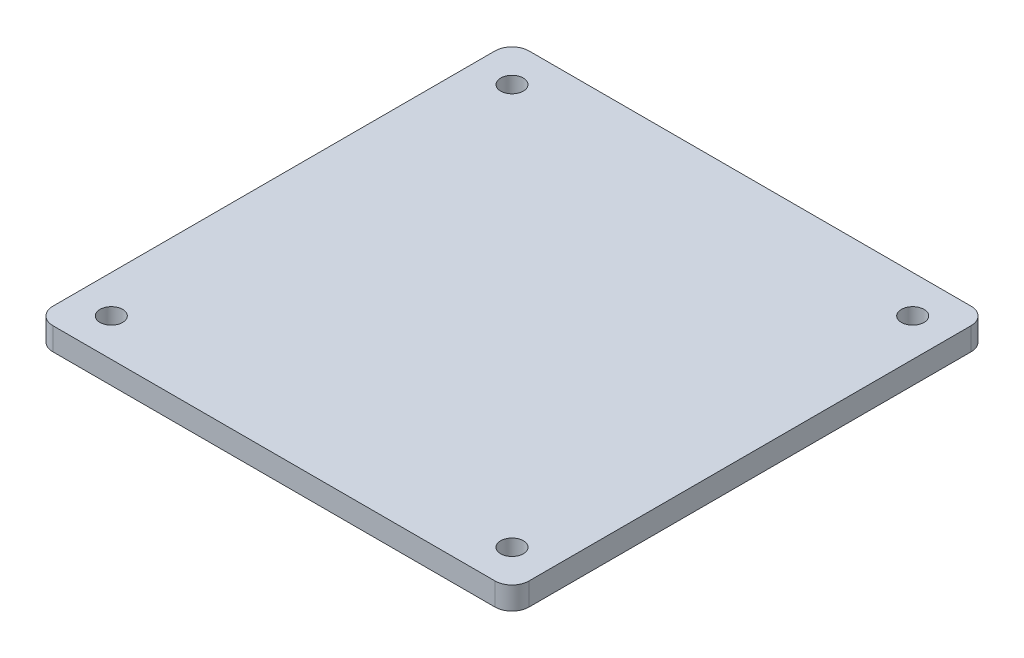
ISO-10303-21;
HEADER;
FILE_DESCRIPTION(('STEP AP214'),'2;1');
FILE_NAME('part.step','',(''),(''),'','','');
FILE_SCHEMA(('AUTOMOTIVE_DESIGN { 1 0 10303 214 1 1 1 1 }'));
ENDSEC;
DATA;
#1=APPLICATION_CONTEXT('core data for automotive mechanical design processes');
#2=APPLICATION_PROTOCOL_DEFINITION('international standard','automotive_design',2000,#1);
#3=PRODUCT_CONTEXT('',#1,'mechanical');
#4=PRODUCT('Part','Part','',(#3));
#5=PRODUCT_RELATED_PRODUCT_CATEGORY('part','',(#4));
#6=PRODUCT_DEFINITION_FORMATION('','',#4);
#7=PRODUCT_DEFINITION_CONTEXT('part definition',#1,'design');
#8=PRODUCT_DEFINITION('design','',#6,#7);
#9=PRODUCT_DEFINITION_SHAPE('','',#8);
#10=(LENGTH_UNIT() NAMED_UNIT(*) SI_UNIT(.MILLI.,.METRE.));
#11=(NAMED_UNIT(*) PLANE_ANGLE_UNIT() SI_UNIT($,.RADIAN.));
#12=(NAMED_UNIT(*) SI_UNIT($,.STERADIAN.) SOLID_ANGLE_UNIT());
#13=UNCERTAINTY_MEASURE_WITH_UNIT(LENGTH_MEASURE(1.E-05),#10,'distance_accuracy_value','');
#14=(GEOMETRIC_REPRESENTATION_CONTEXT(3) GLOBAL_UNCERTAINTY_ASSIGNED_CONTEXT((#13)) GLOBAL_UNIT_ASSIGNED_CONTEXT((#10,
#11,#12)) REPRESENTATION_CONTEXT('',''));
#15=CARTESIAN_POINT('',(0.,0.,0.));
#16=DIRECTION('',(0.,0.,1.));
#17=DIRECTION('',(1.,0.,0.));
#18=AXIS2_PLACEMENT_3D('',#15,#16,#17);
#19=CARTESIAN_POINT('',(195.,20.,195.));
#20=DIRECTION('',(0.,1.,0.));
#21=DIRECTION('',(0.,0.,1.));
#22=AXIS2_PLACEMENT_3D('',#19,#20,#21);
#23=PLANE('',#22);
#24=CARTESIAN_POINT('',(-176.776695296637,20.,176.776695296637));
#25=DIRECTION('',(0.,1.,0.));
#26=DIRECTION('',(0.,0.,1.));
#27=AXIS2_PLACEMENT_3D('',#24,#25,#26);
#28=CIRCLE('',#27,10.);
#29=CARTESIAN_POINT('',(-176.776695296637,20.,186.776695296637));
#30=VERTEX_POINT('',#29);
#31=EDGE_CURVE('E208',#30,#30,#28,.T.);
#32=ORIENTED_EDGE('',*,*,#31,.F.);
#33=EDGE_LOOP('',(#32));
#34=FACE_BOUND('',#33,.T.);
#35=CARTESIAN_POINT('',(176.776695296637,20.,-176.776695296637));
#36=DIRECTION('',(0.,1.,0.));
#37=DIRECTION('',(0.,0.,1.));
#38=AXIS2_PLACEMENT_3D('',#35,#36,#37);
#39=CIRCLE('',#38,10.);
#40=CARTESIAN_POINT('',(176.776695296637,20.,-166.776695296637));
#41=VERTEX_POINT('',#40);
#42=EDGE_CURVE('E147',#41,#41,#39,.T.);
#43=ORIENTED_EDGE('',*,*,#42,.F.);
#44=EDGE_LOOP('',(#43));
#45=FACE_BOUND('',#44,.T.);
#46=CARTESIAN_POINT('',(195.,20.,195.));
#47=DIRECTION('',(0.,1.,0.));
#48=DIRECTION('',(0.,0.,1.));
#49=AXIS2_PLACEMENT_3D('',#46,#47,#48);
#50=CIRCLE('',#49,15.);
#51=CARTESIAN_POINT('',(195.,20.,210.));
#52=VERTEX_POINT('',#51);
#53=CARTESIAN_POINT('',(210.,20.,195.));
#54=VERTEX_POINT('',#53);
#55=EDGE_CURVE('E161',#52,#54,#50,.T.);
#56=ORIENTED_EDGE('',*,*,#55,.T.);
#57=DIRECTION('',(0.,0.,-1.));
#58=VECTOR('',#57,1.);
#59=CARTESIAN_POINT('',(210.,20.,195.));
#60=LINE('',#59,#58);
#61=CARTESIAN_POINT('',(210.,20.,-195.));
#62=VERTEX_POINT('',#61);
#63=EDGE_CURVE('E103',#54,#62,#60,.T.);
#64=ORIENTED_EDGE('',*,*,#63,.T.);
#65=CARTESIAN_POINT('',(195.,20.,-195.));
#66=DIRECTION('',(0.,1.,0.));
#67=DIRECTION('',(0.,0.,-1.));
#68=AXIS2_PLACEMENT_3D('',#65,#66,#67);
#69=CIRCLE('',#68,15.);
#70=CARTESIAN_POINT('',(195.,20.,-210.));
#71=VERTEX_POINT('',#70);
#72=EDGE_CURVE('E177',#62,#71,#69,.T.);
#73=ORIENTED_EDGE('',*,*,#72,.T.);
#74=DIRECTION('',(-1.,0.,0.));
#75=VECTOR('',#74,1.);
#76=CARTESIAN_POINT('',(-195.,20.,-210.));
#77=LINE('',#76,#75);
#78=CARTESIAN_POINT('',(-195.,20.,-210.));
#79=VERTEX_POINT('',#78);
#80=EDGE_CURVE('E190',#71,#79,#77,.T.);
#81=ORIENTED_EDGE('',*,*,#80,.T.);
#82=CARTESIAN_POINT('',(-195.,20.,-195.));
#83=DIRECTION('',(0.,1.,0.));
#84=DIRECTION('',(0.,0.,-1.));
#85=AXIS2_PLACEMENT_3D('',#82,#83,#84);
#86=CIRCLE('',#85,15.);
#87=CARTESIAN_POINT('',(-210.,20.,-195.));
#88=VERTEX_POINT('',#87);
#89=EDGE_CURVE('E122',#79,#88,#86,.T.);
#90=ORIENTED_EDGE('',*,*,#89,.T.);
#91=DIRECTION('',(0.,0.,1.));
#92=VECTOR('',#91,1.);
#93=CARTESIAN_POINT('',(-210.,20.,195.));
#94=LINE('',#93,#92);
#95=CARTESIAN_POINT('',(-210.,20.,195.));
#96=VERTEX_POINT('',#95);
#97=EDGE_CURVE('E116',#88,#96,#94,.T.);
#98=ORIENTED_EDGE('',*,*,#97,.T.);
#99=CARTESIAN_POINT('',(-195.,20.,195.));
#100=DIRECTION('',(0.,1.,0.));
#101=DIRECTION('',(0.,0.,-1.));
#102=AXIS2_PLACEMENT_3D('',#99,#100,#101);
#103=CIRCLE('',#102,15.);
#104=CARTESIAN_POINT('',(-195.,20.,210.));
#105=VERTEX_POINT('',#104);
#106=EDGE_CURVE('E120',#96,#105,#103,.T.);
#107=ORIENTED_EDGE('',*,*,#106,.T.);
#108=DIRECTION('',(1.,0.,0.));
#109=VECTOR('',#108,1.);
#110=CARTESIAN_POINT('',(-195.,20.,210.));
#111=LINE('',#110,#109);
#112=EDGE_CURVE('E58',#105,#52,#111,.T.);
#113=ORIENTED_EDGE('',*,*,#112,.T.);
#114=EDGE_LOOP('',(#56,#64,#73,#81,#90,#98,#107,#113));
#115=FACE_BOUND('',#114,.T.);
#116=CARTESIAN_POINT('',(176.776695296637,20.,176.776695296637));
#117=DIRECTION('',(0.,1.,0.));
#118=DIRECTION('',(0.,0.,-1.));
#119=AXIS2_PLACEMENT_3D('',#116,#117,#118);
#120=CIRCLE('',#119,10.);
#121=CARTESIAN_POINT('',(176.776695296637,20.,166.776695296637));
#122=VERTEX_POINT('',#121);
#123=EDGE_CURVE('E201',#122,#122,#120,.T.);
#124=ORIENTED_EDGE('',*,*,#123,.F.);
#125=EDGE_LOOP('',(#124));
#126=FACE_BOUND('',#125,.T.);
#127=CARTESIAN_POINT('',(-176.776695296637,20.,-176.776695296637));
#128=DIRECTION('',(0.,1.,0.));
#129=DIRECTION('',(0.,0.,-1.));
#130=AXIS2_PLACEMENT_3D('',#127,#128,#129);
#131=CIRCLE('',#130,10.);
#132=CARTESIAN_POINT('',(-176.776695296637,20.,-186.776695296637));
#133=VERTEX_POINT('',#132);
#134=EDGE_CURVE('E216',#133,#133,#131,.T.);
#135=ORIENTED_EDGE('',*,*,#134,.F.);
#136=EDGE_LOOP('',(#135));
#137=FACE_BOUND('',#136,.T.);
#138=ADVANCED_FACE('F38',(#34,#45,#115,#126,#137),#23,.T.);
#139=CARTESIAN_POINT('',(195.,0.,195.));
#140=DIRECTION('',(0.,1.,0.));
#141=DIRECTION('',(0.,0.,1.));
#142=AXIS2_PLACEMENT_3D('',#139,#140,#141);
#143=PLANE('',#142);
#144=CARTESIAN_POINT('',(195.,0.,195.));
#145=DIRECTION('',(0.,1.,0.));
#146=DIRECTION('',(0.,0.,1.));
#147=AXIS2_PLACEMENT_3D('',#144,#145,#146);
#148=CIRCLE('',#147,15.);
#149=CARTESIAN_POINT('',(195.,0.,210.));
#150=VERTEX_POINT('',#149);
#151=CARTESIAN_POINT('',(210.,0.,195.));
#152=VERTEX_POINT('',#151);
#153=EDGE_CURVE('E142',#150,#152,#148,.T.);
#154=ORIENTED_EDGE('',*,*,#153,.F.);
#155=DIRECTION('',(1.,0.,0.));
#156=VECTOR('',#155,1.);
#157=CARTESIAN_POINT('',(-195.,0.,210.));
#158=LINE('',#157,#156);
#159=CARTESIAN_POINT('',(-195.,0.,210.));
#160=VERTEX_POINT('',#159);
#161=EDGE_CURVE('E95',#160,#150,#158,.T.);
#162=ORIENTED_EDGE('',*,*,#161,.F.);
#163=CARTESIAN_POINT('',(-195.,0.,195.));
#164=DIRECTION('',(0.,1.,0.));
#165=DIRECTION('',(0.,0.,-1.));
#166=AXIS2_PLACEMENT_3D('',#163,#164,#165);
#167=CIRCLE('',#166,15.);
#168=CARTESIAN_POINT('',(-210.,0.,195.));
#169=VERTEX_POINT('',#168);
#170=EDGE_CURVE('E88',#169,#160,#167,.T.);
#171=ORIENTED_EDGE('',*,*,#170,.F.);
#172=DIRECTION('',(0.,0.,1.));
#173=VECTOR('',#172,1.);
#174=CARTESIAN_POINT('',(-210.,0.,195.));
#175=LINE('',#174,#173);
#176=CARTESIAN_POINT('',(-210.,0.,-195.));
#177=VERTEX_POINT('',#176);
#178=EDGE_CURVE('E131',#177,#169,#175,.T.);
#179=ORIENTED_EDGE('',*,*,#178,.F.);
#180=CARTESIAN_POINT('',(-195.,0.,-195.));
#181=DIRECTION('',(0.,1.,0.));
#182=DIRECTION('',(0.,0.,-1.));
#183=AXIS2_PLACEMENT_3D('',#180,#181,#182);
#184=CIRCLE('',#183,15.);
#185=CARTESIAN_POINT('',(-195.,0.,-210.));
#186=VERTEX_POINT('',#185);
#187=EDGE_CURVE('E154',#186,#177,#184,.T.);
#188=ORIENTED_EDGE('',*,*,#187,.F.);
#189=DIRECTION('',(-1.,0.,0.));
#190=VECTOR('',#189,1.);
#191=CARTESIAN_POINT('',(-195.,0.,-210.));
#192=LINE('',#191,#190);
#193=CARTESIAN_POINT('',(195.,0.,-210.));
#194=VERTEX_POINT('',#193);
#195=EDGE_CURVE('E152',#194,#186,#192,.T.);
#196=ORIENTED_EDGE('',*,*,#195,.F.);
#197=CARTESIAN_POINT('',(195.,0.,-195.));
#198=DIRECTION('',(0.,1.,0.));
#199=DIRECTION('',(0.,0.,-1.));
#200=AXIS2_PLACEMENT_3D('',#197,#198,#199);
#201=CIRCLE('',#200,15.);
#202=CARTESIAN_POINT('',(210.,0.,-195.));
#203=VERTEX_POINT('',#202);
#204=EDGE_CURVE('E150',#203,#194,#201,.T.);
#205=ORIENTED_EDGE('',*,*,#204,.F.);
#206=DIRECTION('',(0.,0.,-1.));
#207=VECTOR('',#206,1.);
#208=CARTESIAN_POINT('',(210.,0.,195.));
#209=LINE('',#208,#207);
#210=EDGE_CURVE('E146',#152,#203,#209,.T.);
#211=ORIENTED_EDGE('',*,*,#210,.F.);
#212=EDGE_LOOP('',(#154,#162,#171,#179,#188,#196,#205,#211));
#213=FACE_BOUND('',#212,.T.);
#214=CARTESIAN_POINT('',(176.776695296637,0.,-176.776695296637));
#215=DIRECTION('',(0.,1.,0.));
#216=DIRECTION('',(0.,0.,1.));
#217=AXIS2_PLACEMENT_3D('',#214,#215,#216);
#218=CIRCLE('',#217,10.);
#219=CARTESIAN_POINT('',(176.776695296637,0.,-166.776695296637));
#220=VERTEX_POINT('',#219);
#221=EDGE_CURVE('E198',#220,#220,#218,.T.);
#222=ORIENTED_EDGE('',*,*,#221,.T.);
#223=EDGE_LOOP('',(#222));
#224=FACE_BOUND('',#223,.T.);
#225=CARTESIAN_POINT('',(176.776695296637,0.,176.776695296637));
#226=DIRECTION('',(0.,1.,0.));
#227=DIRECTION('',(0.,0.,-1.));
#228=AXIS2_PLACEMENT_3D('',#225,#226,#227);
#229=CIRCLE('',#228,10.);
#230=CARTESIAN_POINT('',(176.776695296637,0.,166.776695296637));
#231=VERTEX_POINT('',#230);
#232=EDGE_CURVE('E204',#231,#231,#229,.T.);
#233=ORIENTED_EDGE('',*,*,#232,.T.);
#234=EDGE_LOOP('',(#233));
#235=FACE_BOUND('',#234,.T.);
#236=CARTESIAN_POINT('',(-176.776695296637,0.,176.776695296637));
#237=DIRECTION('',(0.,1.,0.));
#238=DIRECTION('',(0.,0.,1.));
#239=AXIS2_PLACEMENT_3D('',#236,#237,#238);
#240=CIRCLE('',#239,10.);
#241=CARTESIAN_POINT('',(-176.776695296637,0.,186.776695296637));
#242=VERTEX_POINT('',#241);
#243=EDGE_CURVE('E212',#242,#242,#240,.T.);
#244=ORIENTED_EDGE('',*,*,#243,.T.);
#245=EDGE_LOOP('',(#244));
#246=FACE_BOUND('',#245,.T.);
#247=CARTESIAN_POINT('',(-176.776695296637,0.,-176.776695296637));
#248=DIRECTION('',(0.,1.,0.));
#249=DIRECTION('',(0.,0.,-1.));
#250=AXIS2_PLACEMENT_3D('',#247,#248,#249);
#251=CIRCLE('',#250,10.);
#252=CARTESIAN_POINT('',(-176.776695296637,0.,-186.776695296637));
#253=VERTEX_POINT('',#252);
#254=EDGE_CURVE('E220',#253,#253,#251,.T.);
#255=ORIENTED_EDGE('',*,*,#254,.T.);
#256=EDGE_LOOP('',(#255));
#257=FACE_BOUND('',#256,.T.);
#258=ADVANCED_FACE('F181',(#213,#224,#235,#246,#257),#143,.F.);
#259=CARTESIAN_POINT('',(195.,20.,195.));
#260=DIRECTION('',(0.,-1.,0.));
#261=DIRECTION('',(0.,0.,-1.));
#262=AXIS2_PLACEMENT_3D('',#259,#260,#261);
#263=CYLINDRICAL_SURFACE('',#262,15.);
#264=ORIENTED_EDGE('',*,*,#153,.T.);
#265=DIRECTION('',(0.,-1.,0.));
#266=VECTOR('',#265,1.);
#267=CARTESIAN_POINT('',(210.,20.,195.));
#268=LINE('',#267,#266);
#269=EDGE_CURVE('E11',#54,#152,#268,.T.);
#270=ORIENTED_EDGE('',*,*,#269,.F.);
#271=ORIENTED_EDGE('',*,*,#55,.F.);
#272=DIRECTION('',(0.,-1.,0.));
#273=VECTOR('',#272,1.);
#274=CARTESIAN_POINT('',(195.,20.,210.));
#275=LINE('',#274,#273);
#276=EDGE_CURVE('E138',#52,#150,#275,.T.);
#277=ORIENTED_EDGE('',*,*,#276,.T.);
#278=EDGE_LOOP('',(#264,#270,#271,#277));
#279=FACE_BOUND('',#278,.T.);
#280=ADVANCED_FACE('F40',(#279),#263,.T.);
#281=CARTESIAN_POINT('',(210.,20.,195.));
#282=DIRECTION('',(-1.,0.,0.));
#283=DIRECTION('',(0.,0.,1.));
#284=AXIS2_PLACEMENT_3D('',#281,#282,#283);
#285=PLANE('',#284);
#286=ORIENTED_EDGE('',*,*,#210,.T.);
#287=DIRECTION('',(0.,-1.,0.));
#288=VECTOR('',#287,1.);
#289=CARTESIAN_POINT('',(210.,20.,-195.));
#290=LINE('',#289,#288);
#291=EDGE_CURVE('E48',#62,#203,#290,.T.);
#292=ORIENTED_EDGE('',*,*,#291,.F.);
#293=ORIENTED_EDGE('',*,*,#63,.F.);
#294=ORIENTED_EDGE('',*,*,#269,.T.);
#295=EDGE_LOOP('',(#286,#292,#293,#294));
#296=FACE_BOUND('',#295,.T.);
#297=ADVANCED_FACE('F255',(#296),#285,.F.);
#298=CARTESIAN_POINT('',(195.,20.,-195.));
#299=DIRECTION('',(0.,-1.,0.));
#300=DIRECTION('',(0.,0.,-1.));
#301=AXIS2_PLACEMENT_3D('',#298,#299,#300);
#302=CYLINDRICAL_SURFACE('',#301,15.);
#303=ORIENTED_EDGE('',*,*,#204,.T.);
#304=DIRECTION('',(0.,-1.,0.));
#305=VECTOR('',#304,1.);
#306=CARTESIAN_POINT('',(195.,20.,-210.));
#307=LINE('',#306,#305);
#308=EDGE_CURVE('E169',#71,#194,#307,.T.);
#309=ORIENTED_EDGE('',*,*,#308,.F.);
#310=ORIENTED_EDGE('',*,*,#72,.F.);
#311=ORIENTED_EDGE('',*,*,#291,.T.);
#312=EDGE_LOOP('',(#303,#309,#310,#311));
#313=FACE_BOUND('',#312,.T.);
#314=ADVANCED_FACE('F175',(#313),#302,.T.);
#315=CARTESIAN_POINT('',(-195.,20.,-210.));
#316=DIRECTION('',(0.,0.,1.));
#317=DIRECTION('',(1.,0.,0.));
#318=AXIS2_PLACEMENT_3D('',#315,#316,#317);
#319=PLANE('',#318);
#320=ORIENTED_EDGE('',*,*,#195,.T.);
#321=DIRECTION('',(0.,-1.,0.));
#322=VECTOR('',#321,1.);
#323=CARTESIAN_POINT('',(-195.,20.,-210.));
#324=LINE('',#323,#322);
#325=EDGE_CURVE('E166',#79,#186,#324,.T.);
#326=ORIENTED_EDGE('',*,*,#325,.F.);
#327=ORIENTED_EDGE('',*,*,#80,.F.);
#328=ORIENTED_EDGE('',*,*,#308,.T.);
#329=EDGE_LOOP('',(#320,#326,#327,#328));
#330=FACE_BOUND('',#329,.T.);
#331=ADVANCED_FACE('F186',(#330),#319,.F.);
#332=CARTESIAN_POINT('',(-195.,20.,-195.));
#333=DIRECTION('',(0.,-1.,0.));
#334=DIRECTION('',(0.,0.,-1.));
#335=AXIS2_PLACEMENT_3D('',#332,#333,#334);
#336=CYLINDRICAL_SURFACE('',#335,15.);
#337=ORIENTED_EDGE('',*,*,#187,.T.);
#338=DIRECTION('',(0.,-1.,0.));
#339=VECTOR('',#338,1.);
#340=CARTESIAN_POINT('',(-210.,20.,-195.));
#341=LINE('',#340,#339);
#342=EDGE_CURVE('E132',#88,#177,#341,.T.);
#343=ORIENTED_EDGE('',*,*,#342,.F.);
#344=ORIENTED_EDGE('',*,*,#89,.F.);
#345=ORIENTED_EDGE('',*,*,#325,.T.);
#346=EDGE_LOOP('',(#337,#343,#344,#345));
#347=FACE_BOUND('',#346,.T.);
#348=ADVANCED_FACE('F189',(#347),#336,.T.);
#349=CARTESIAN_POINT('',(-210.,20.,195.));
#350=DIRECTION('',(1.,0.,0.));
#351=DIRECTION('',(0.,0.,-1.));
#352=AXIS2_PLACEMENT_3D('',#349,#350,#351);
#353=PLANE('',#352);
#354=ORIENTED_EDGE('',*,*,#178,.T.);
#355=DIRECTION('',(0.,-1.,0.));
#356=VECTOR('',#355,1.);
#357=CARTESIAN_POINT('',(-210.,20.,195.));
#358=LINE('',#357,#356);
#359=EDGE_CURVE('E128',#96,#169,#358,.T.);
#360=ORIENTED_EDGE('',*,*,#359,.F.);
#361=ORIENTED_EDGE('',*,*,#97,.F.);
#362=ORIENTED_EDGE('',*,*,#342,.T.);
#363=EDGE_LOOP('',(#354,#360,#361,#362));
#364=FACE_BOUND('',#363,.T.);
#365=ADVANCED_FACE('F129',(#364),#353,.F.);
#366=CARTESIAN_POINT('',(-195.,20.,195.));
#367=DIRECTION('',(0.,-1.,0.));
#368=DIRECTION('',(0.,0.,-1.));
#369=AXIS2_PLACEMENT_3D('',#366,#367,#368);
#370=CYLINDRICAL_SURFACE('',#369,15.);
#371=ORIENTED_EDGE('',*,*,#170,.T.);
#372=DIRECTION('',(0.,-1.,0.));
#373=VECTOR('',#372,1.);
#374=CARTESIAN_POINT('',(-195.,20.,210.));
#375=LINE('',#374,#373);
#376=EDGE_CURVE('E133',#105,#160,#375,.T.);
#377=ORIENTED_EDGE('',*,*,#376,.F.);
#378=ORIENTED_EDGE('',*,*,#106,.F.);
#379=ORIENTED_EDGE('',*,*,#359,.T.);
#380=EDGE_LOOP('',(#371,#377,#378,#379));
#381=FACE_BOUND('',#380,.T.);
#382=ADVANCED_FACE('F135',(#381),#370,.T.);
#383=CARTESIAN_POINT('',(-195.,20.,210.));
#384=DIRECTION('',(0.,0.,-1.));
#385=DIRECTION('',(-1.,0.,0.));
#386=AXIS2_PLACEMENT_3D('',#383,#384,#385);
#387=PLANE('',#386);
#388=ORIENTED_EDGE('',*,*,#161,.T.);
#389=ORIENTED_EDGE('',*,*,#276,.F.);
#390=ORIENTED_EDGE('',*,*,#112,.F.);
#391=ORIENTED_EDGE('',*,*,#376,.T.);
#392=EDGE_LOOP('',(#388,#389,#390,#391));
#393=FACE_BOUND('',#392,.T.);
#394=ADVANCED_FACE('F243',(#393),#387,.F.);
#395=CARTESIAN_POINT('',(176.776695296637,20.,-176.776695296637));
#396=DIRECTION('',(0.,-1.,0.));
#397=DIRECTION('',(0.,0.,-1.));
#398=AXIS2_PLACEMENT_3D('',#395,#396,#397);
#399=CYLINDRICAL_SURFACE('',#398,10.);
#400=ORIENTED_EDGE('',*,*,#42,.T.);
#401=EDGE_LOOP('',(#400));
#402=FACE_BOUND('',#401,.T.);
#403=ORIENTED_EDGE('',*,*,#221,.F.);
#404=EDGE_LOOP('',(#403));
#405=FACE_BOUND('',#404,.T.);
#406=ADVANCED_FACE('F240',(#402,#405),#399,.F.);
#407=CARTESIAN_POINT('',(176.776695296637,20.,176.776695296637));
#408=DIRECTION('',(0.,-1.,0.));
#409=DIRECTION('',(0.,0.,-1.));
#410=AXIS2_PLACEMENT_3D('',#407,#408,#409);
#411=CYLINDRICAL_SURFACE('',#410,10.);
#412=ORIENTED_EDGE('',*,*,#123,.T.);
#413=EDGE_LOOP('',(#412));
#414=FACE_BOUND('',#413,.T.);
#415=ORIENTED_EDGE('',*,*,#232,.F.);
#416=EDGE_LOOP('',(#415));
#417=FACE_BOUND('',#416,.T.);
#418=ADVANCED_FACE('F324',(#414,#417),#411,.F.);
#419=CARTESIAN_POINT('',(-176.776695296637,20.,176.776695296637));
#420=DIRECTION('',(0.,-1.,0.));
#421=DIRECTION('',(0.,0.,-1.));
#422=AXIS2_PLACEMENT_3D('',#419,#420,#421);
#423=CYLINDRICAL_SURFACE('',#422,10.);
#424=ORIENTED_EDGE('',*,*,#31,.T.);
#425=EDGE_LOOP('',(#424));
#426=FACE_BOUND('',#425,.T.);
#427=ORIENTED_EDGE('',*,*,#243,.F.);
#428=EDGE_LOOP('',(#427));
#429=FACE_BOUND('',#428,.T.);
#430=ADVANCED_FACE('F333',(#426,#429),#423,.F.);
#431=CARTESIAN_POINT('',(-176.776695296637,20.,-176.776695296637));
#432=DIRECTION('',(0.,-1.,0.));
#433=DIRECTION('',(0.,0.,-1.));
#434=AXIS2_PLACEMENT_3D('',#431,#432,#433);
#435=CYLINDRICAL_SURFACE('',#434,10.);
#436=ORIENTED_EDGE('',*,*,#134,.T.);
#437=EDGE_LOOP('',(#436));
#438=FACE_BOUND('',#437,.T.);
#439=ORIENTED_EDGE('',*,*,#254,.F.);
#440=EDGE_LOOP('',(#439));
#441=FACE_BOUND('',#440,.T.);
#442=ADVANCED_FACE('F227',(#438,#441),#435,.F.);
#443=CLOSED_SHELL('',(#138,#258,#280,#297,#314,#331,#348,#365,#382,#394,#406,#418,#430,#442));
#444=MANIFOLD_SOLID_BREP('B2',#443);
#445=ADVANCED_BREP_SHAPE_REPRESENTATION('',(#18,#444),#14);
#446=SHAPE_DEFINITION_REPRESENTATION(#9,#445);
ENDSEC;
END-ISO-10303-21;
